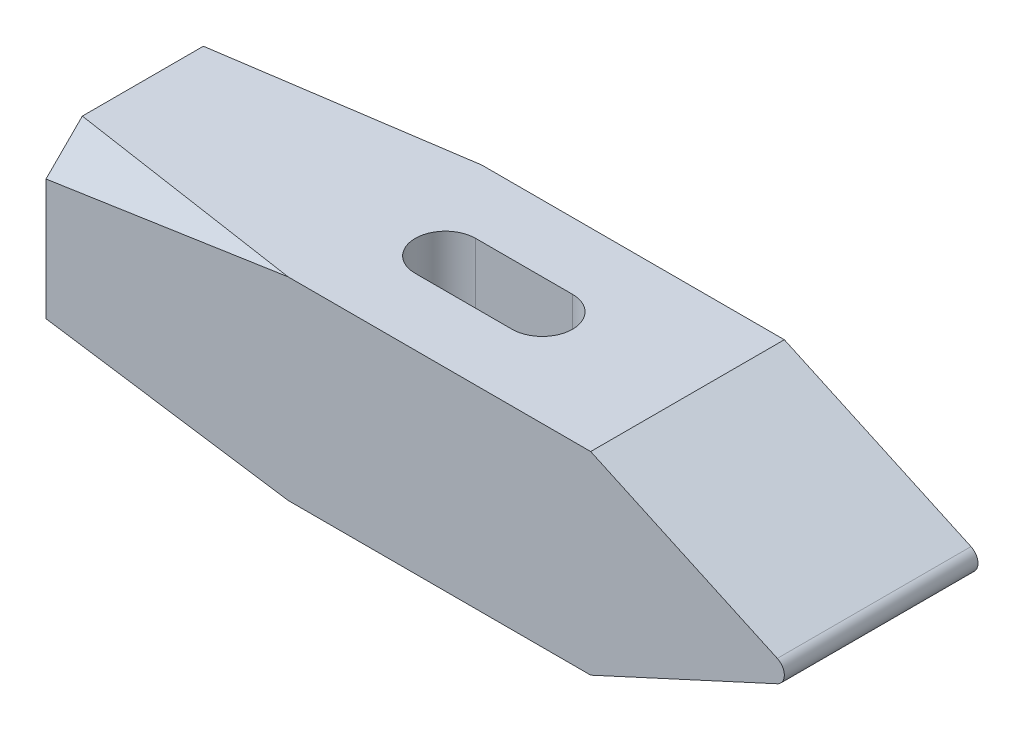
ISO-10303-21;
HEADER;
FILE_DESCRIPTION(('STEP AP214'),'2;1');
FILE_NAME('part.step','',(''),(''),'','','');
FILE_SCHEMA(('AUTOMOTIVE_DESIGN { 1 0 10303 214 1 1 1 1 }'));
ENDSEC;
DATA;
#1=APPLICATION_CONTEXT('core data for automotive mechanical design processes');
#2=APPLICATION_PROTOCOL_DEFINITION('international standard','automotive_design',2000,#1);
#3=PRODUCT_CONTEXT('',#1,'mechanical');
#4=PRODUCT('Part','Part','',(#3));
#5=PRODUCT_RELATED_PRODUCT_CATEGORY('part','',(#4));
#6=PRODUCT_DEFINITION_FORMATION('','',#4);
#7=PRODUCT_DEFINITION_CONTEXT('part definition',#1,'design');
#8=PRODUCT_DEFINITION('design','',#6,#7);
#9=PRODUCT_DEFINITION_SHAPE('','',#8);
#10=(LENGTH_UNIT() NAMED_UNIT(*) SI_UNIT(.MILLI.,.METRE.));
#11=(NAMED_UNIT(*) PLANE_ANGLE_UNIT() SI_UNIT($,.RADIAN.));
#12=(NAMED_UNIT(*) SI_UNIT($,.STERADIAN.) SOLID_ANGLE_UNIT());
#13=UNCERTAINTY_MEASURE_WITH_UNIT(LENGTH_MEASURE(1.E-05),#10,'distance_accuracy_value','');
#14=(GEOMETRIC_REPRESENTATION_CONTEXT(3) GLOBAL_UNCERTAINTY_ASSIGNED_CONTEXT((#13)) GLOBAL_UNIT_ASSIGNED_CONTEXT((#10,
#11,#12)) REPRESENTATION_CONTEXT('',''));
#15=CARTESIAN_POINT('',(0.,0.,0.));
#16=DIRECTION('',(0.,0.,1.));
#17=DIRECTION('',(1.,0.,0.));
#18=AXIS2_PLACEMENT_3D('',#15,#16,#17);
#19=CARTESIAN_POINT('',(0.,16.,32.));
#20=DIRECTION('',(1.,0.,0.));
#21=DIRECTION('',(0.,1.,0.));
#22=AXIS2_PLACEMENT_3D('',#19,#20,#21);
#23=PLANE('',#22);
#24=DIRECTION('',(0.,0.,-1.));
#25=VECTOR('',#24,1.);
#26=CARTESIAN_POINT('',(0.,16.,32.));
#27=LINE('',#26,#25);
#28=CARTESIAN_POINT('',(0.,16.,26.));
#29=VERTEX_POINT('',#28);
#30=CARTESIAN_POINT('',(0.,16.,6.));
#31=VERTEX_POINT('',#30);
#32=EDGE_CURVE('E11',#29,#31,#27,.T.);
#33=ORIENTED_EDGE('',*,*,#32,.T.);
#34=DIRECTION('',(0.,-0.707106781186547,-0.707106781186547));
#35=VECTOR('',#34,1.);
#36=CARTESIAN_POINT('',(0.,10.,0.));
#37=LINE('',#36,#35);
#38=CARTESIAN_POINT('',(0.,10.,0.));
#39=VERTEX_POINT('',#38);
#40=EDGE_CURVE('E64',#31,#39,#37,.T.);
#41=ORIENTED_EDGE('',*,*,#40,.T.);
#42=DIRECTION('',(0.,-1.,0.));
#43=VECTOR('',#42,1.);
#44=CARTESIAN_POINT('',(0.,16.,0.));
#45=LINE('',#44,#43);
#46=CARTESIAN_POINT('',(0.,-10.,0.));
#47=VERTEX_POINT('',#46);
#48=EDGE_CURVE('E70',#39,#47,#45,.T.);
#49=ORIENTED_EDGE('',*,*,#48,.T.);
#50=DIRECTION('',(0.,0.707106781186547,-0.707106781186548));
#51=VECTOR('',#50,1.);
#52=CARTESIAN_POINT('',(0.,-10.,0.));
#53=LINE('',#52,#51);
#54=CARTESIAN_POINT('',(0.,-16.,6.));
#55=VERTEX_POINT('',#54);
#56=EDGE_CURVE('E213',#55,#47,#53,.T.);
#57=ORIENTED_EDGE('',*,*,#56,.F.);
#58=DIRECTION('',(0.,0.,-1.));
#59=VECTOR('',#58,1.);
#60=CARTESIAN_POINT('',(0.,-16.,32.));
#61=LINE('',#60,#59);
#62=CARTESIAN_POINT('',(0.,-16.,26.));
#63=VERTEX_POINT('',#62);
#64=EDGE_CURVE('E53',#63,#55,#61,.T.);
#65=ORIENTED_EDGE('',*,*,#64,.F.);
#66=DIRECTION('',(0.,-0.707106781186548,-0.707106781186547));
#67=VECTOR('',#66,1.);
#68=CARTESIAN_POINT('',(0.,-10.,32.));
#69=LINE('',#68,#67);
#70=CARTESIAN_POINT('',(0.,-10.,32.));
#71=VERTEX_POINT('',#70);
#72=EDGE_CURVE('E211',#71,#63,#69,.T.);
#73=ORIENTED_EDGE('',*,*,#72,.F.);
#74=DIRECTION('',(0.,-1.,0.));
#75=VECTOR('',#74,1.);
#76=CARTESIAN_POINT('',(0.,16.,32.));
#77=LINE('',#76,#75);
#78=CARTESIAN_POINT('',(0.,10.,32.));
#79=VERTEX_POINT('',#78);
#80=EDGE_CURVE('E283',#79,#71,#77,.T.);
#81=ORIENTED_EDGE('',*,*,#80,.F.);
#82=DIRECTION('',(0.,-0.707106781186548,0.707106781186547));
#83=VECTOR('',#82,1.);
#84=CARTESIAN_POINT('',(0.,21.,21.));
#85=LINE('',#84,#83);
#86=EDGE_CURVE('E228',#29,#79,#85,.T.);
#87=ORIENTED_EDGE('',*,*,#86,.F.);
#88=EDGE_LOOP('',(#33,#41,#49,#57,#65,#73,#81,#87));
#89=FACE_BOUND('',#88,.T.);
#90=ADVANCED_FACE('F44',(#89),#23,.F.);
#91=CARTESIAN_POINT('',(0.,-16.,32.));
#92=DIRECTION('',(0.,1.,0.));
#93=DIRECTION('',(0.,0.,1.));
#94=AXIS2_PLACEMENT_3D('',#91,#92,#93);
#95=PLANE('',#94);
#96=DIRECTION('',(-1.,0.,0.));
#97=VECTOR('',#96,1.);
#98=CARTESIAN_POINT('',(50.,-16.,11.));
#99=LINE('',#98,#97);
#100=CARTESIAN_POINT('',(66.,-16.,11.));
#101=VERTEX_POINT('',#100);
#102=CARTESIAN_POINT('',(50.,-16.,11.));
#103=VERTEX_POINT('',#102);
#104=EDGE_CURVE('E252',#101,#103,#99,.T.);
#105=ORIENTED_EDGE('',*,*,#104,.T.);
#106=CARTESIAN_POINT('',(50.,-16.,16.));
#107=DIRECTION('',(0.,1.,0.));
#108=DIRECTION('',(-1.,0.,0.));
#109=AXIS2_PLACEMENT_3D('',#106,#107,#108);
#110=CIRCLE('',#109,5.);
#111=CARTESIAN_POINT('',(50.,-16.,21.));
#112=VERTEX_POINT('',#111);
#113=EDGE_CURVE('E239',#103,#112,#110,.T.);
#114=ORIENTED_EDGE('',*,*,#113,.T.);
#115=DIRECTION('',(1.,0.,0.));
#116=VECTOR('',#115,1.);
#117=CARTESIAN_POINT('',(50.,-16.,21.));
#118=LINE('',#117,#116);
#119=CARTESIAN_POINT('',(66.,-16.,21.));
#120=VERTEX_POINT('',#119);
#121=EDGE_CURVE('E245',#112,#120,#118,.T.);
#122=ORIENTED_EDGE('',*,*,#121,.T.);
#123=CARTESIAN_POINT('',(66.,-16.,16.));
#124=DIRECTION('',(0.,1.,0.));
#125=DIRECTION('',(-1.,0.,0.));
#126=AXIS2_PLACEMENT_3D('',#123,#124,#125);
#127=CIRCLE('',#126,5.);
#128=EDGE_CURVE('E250',#120,#101,#127,.T.);
#129=ORIENTED_EDGE('',*,*,#128,.T.);
#130=EDGE_LOOP('',(#105,#114,#122,#129));
#131=FACE_BOUND('',#130,.T.);
#132=DIRECTION('',(-0.988936352868298,0.,0.148340452930245));
#133=VECTOR('',#132,1.);
#134=CARTESIAN_POINT('',(0.,-16.,6.));
#135=LINE('',#134,#133);
#136=CARTESIAN_POINT('',(40.,-16.,0.));
#137=VERTEX_POINT('',#136);
#138=EDGE_CURVE('E153',#137,#55,#135,.T.);
#139=ORIENTED_EDGE('',*,*,#138,.F.);
#140=DIRECTION('',(1.,0.,0.));
#141=VECTOR('',#140,1.);
#142=CARTESIAN_POINT('',(0.,-16.,0.));
#143=LINE('',#142,#141);
#144=CARTESIAN_POINT('',(90.,-16.,0.));
#145=VERTEX_POINT('',#144);
#146=EDGE_CURVE('E163',#137,#145,#143,.T.);
#147=ORIENTED_EDGE('',*,*,#146,.T.);
#148=DIRECTION('',(0.,0.,-1.));
#149=VECTOR('',#148,1.);
#150=CARTESIAN_POINT('',(90.,-16.,32.));
#151=LINE('',#150,#149);
#152=CARTESIAN_POINT('',(90.,-16.,32.));
#153=VERTEX_POINT('',#152);
#154=EDGE_CURVE('E197',#153,#145,#151,.T.);
#155=ORIENTED_EDGE('',*,*,#154,.F.);
#156=DIRECTION('',(1.,0.,0.));
#157=VECTOR('',#156,1.);
#158=CARTESIAN_POINT('',(0.,-16.,32.));
#159=LINE('',#158,#157);
#160=CARTESIAN_POINT('',(40.,-16.,32.));
#161=VERTEX_POINT('',#160);
#162=EDGE_CURVE('E286',#161,#153,#159,.T.);
#163=ORIENTED_EDGE('',*,*,#162,.F.);
#164=DIRECTION('',(0.988936352868298,0.,0.148340452930245));
#165=VECTOR('',#164,1.);
#166=CARTESIAN_POINT('',(0.,-16.,26.));
#167=LINE('',#166,#165);
#168=EDGE_CURVE('E208',#63,#161,#167,.T.);
#169=ORIENTED_EDGE('',*,*,#168,.F.);
#170=ORIENTED_EDGE('',*,*,#64,.T.);
#171=EDGE_LOOP('',(#139,#147,#155,#163,#169,#170));
#172=FACE_BOUND('',#171,.T.);
#173=ADVANCED_FACE('F206',(#131,#172),#95,.F.);
#174=CARTESIAN_POINT('',(120.,0.,0.));
#175=DIRECTION('',(0.,0.,1.));
#176=DIRECTION('',(1.,0.,0.));
#177=AXIS2_PLACEMENT_3D('',#174,#175,#176);
#178=PLANE('',#177);
#179=ORIENTED_EDGE('',*,*,#48,.F.);
#180=DIRECTION('',(0.988936352868298,0.148340452930245,0.));
#181=VECTOR('',#180,1.);
#182=CARTESIAN_POINT('',(40.,16.,0.));
#183=LINE('',#182,#181);
#184=CARTESIAN_POINT('',(40.,16.,0.));
#185=VERTEX_POINT('',#184);
#186=EDGE_CURVE('E148',#39,#185,#183,.T.);
#187=ORIENTED_EDGE('',*,*,#186,.T.);
#188=DIRECTION('',(-1.,0.,0.));
#189=VECTOR('',#188,1.);
#190=CARTESIAN_POINT('',(90.,16.,0.));
#191=LINE('',#190,#189);
#192=CARTESIAN_POINT('',(90.,16.,0.));
#193=VERTEX_POINT('',#192);
#194=EDGE_CURVE('E164',#193,#185,#191,.T.);
#195=ORIENTED_EDGE('',*,*,#194,.F.);
#196=DIRECTION('',(-0.908506717048987,0.417870249092793,0.));
#197=VECTOR('',#196,1.);
#198=CARTESIAN_POINT('',(120.835740498186,1.81701343409798,0.));
#199=LINE('',#198,#197);
#200=CARTESIAN_POINT('',(120.835740498186,1.81701343409798,0.));
#201=VERTEX_POINT('',#200);
#202=EDGE_CURVE('E177',#201,#193,#199,.T.);
#203=ORIENTED_EDGE('',*,*,#202,.F.);
#204=CARTESIAN_POINT('',(120.,0.,0.));
#205=DIRECTION('',(0.,0.,1.));
#206=DIRECTION('',(1.,0.,0.));
#207=AXIS2_PLACEMENT_3D('',#204,#205,#206);
#208=CIRCLE('',#207,2.00000000000001);
#209=CARTESIAN_POINT('',(120.835740498186,-1.81701343409798,0.));
#210=VERTEX_POINT('',#209);
#211=EDGE_CURVE('E176',#210,#201,#208,.T.);
#212=ORIENTED_EDGE('',*,*,#211,.F.);
#213=DIRECTION('',(0.908506717048987,0.417870249092793,0.));
#214=VECTOR('',#213,1.);
#215=CARTESIAN_POINT('',(90.,-16.,0.));
#216=LINE('',#215,#214);
#217=EDGE_CURVE('E166',#145,#210,#216,.T.);
#218=ORIENTED_EDGE('',*,*,#217,.F.);
#219=ORIENTED_EDGE('',*,*,#146,.F.);
#220=DIRECTION('',(0.988936352868298,-0.148340452930245,0.));
#221=VECTOR('',#220,1.);
#222=CARTESIAN_POINT('',(40.,-16.,0.));
#223=LINE('',#222,#221);
#224=EDGE_CURVE('E165',#47,#137,#223,.T.);
#225=ORIENTED_EDGE('',*,*,#224,.F.);
#226=EDGE_LOOP('',(#179,#187,#195,#203,#212,#218,#219,#225));
#227=FACE_BOUND('',#226,.T.);
#228=ADVANCED_FACE('F159',(#227),#178,.F.);
#229=CARTESIAN_POINT('',(90.,16.,32.));
#230=DIRECTION('',(0.,-1.,0.));
#231=DIRECTION('',(1.,0.,0.));
#232=AXIS2_PLACEMENT_3D('',#229,#230,#231);
#233=PLANE('',#232);
#234=DIRECTION('',(1.,0.,0.));
#235=VECTOR('',#234,1.);
#236=CARTESIAN_POINT('',(50.,16.,21.));
#237=LINE('',#236,#235);
#238=CARTESIAN_POINT('',(50.,16.,21.));
#239=VERTEX_POINT('',#238);
#240=CARTESIAN_POINT('',(66.,16.,21.));
#241=VERTEX_POINT('',#240);
#242=EDGE_CURVE('E259',#239,#241,#237,.T.);
#243=ORIENTED_EDGE('',*,*,#242,.F.);
#244=CARTESIAN_POINT('',(50.,16.,16.));
#245=DIRECTION('',(0.,1.,0.));
#246=DIRECTION('',(-1.,0.,0.));
#247=AXIS2_PLACEMENT_3D('',#244,#245,#246);
#248=CIRCLE('',#247,5.);
#249=CARTESIAN_POINT('',(50.,16.,11.));
#250=VERTEX_POINT('',#249);
#251=EDGE_CURVE('E236',#250,#239,#248,.T.);
#252=ORIENTED_EDGE('',*,*,#251,.F.);
#253=DIRECTION('',(-1.,0.,0.));
#254=VECTOR('',#253,1.);
#255=CARTESIAN_POINT('',(50.,16.,11.));
#256=LINE('',#255,#254);
#257=CARTESIAN_POINT('',(66.,16.,11.));
#258=VERTEX_POINT('',#257);
#259=EDGE_CURVE('E243',#258,#250,#256,.T.);
#260=ORIENTED_EDGE('',*,*,#259,.F.);
#261=CARTESIAN_POINT('',(66.,16.,16.));
#262=DIRECTION('',(0.,1.,0.));
#263=DIRECTION('',(-1.,0.,0.));
#264=AXIS2_PLACEMENT_3D('',#261,#262,#263);
#265=CIRCLE('',#264,5.);
#266=EDGE_CURVE('E263',#241,#258,#265,.T.);
#267=ORIENTED_EDGE('',*,*,#266,.F.);
#268=EDGE_LOOP('',(#243,#252,#260,#267));
#269=FACE_BOUND('',#268,.T.);
#270=ORIENTED_EDGE('',*,*,#194,.T.);
#271=DIRECTION('',(-0.988936352868298,0.,0.148340452930245));
#272=VECTOR('',#271,1.);
#273=CARTESIAN_POINT('',(0.,16.,6.));
#274=LINE('',#273,#272);
#275=EDGE_CURVE('E146',#185,#31,#274,.T.);
#276=ORIENTED_EDGE('',*,*,#275,.T.);
#277=ORIENTED_EDGE('',*,*,#32,.F.);
#278=DIRECTION('',(-0.988936352868298,0.,-0.148340452930245));
#279=VECTOR('',#278,1.);
#280=CARTESIAN_POINT('',(-3.81418092909536,16.,25.4278728606357));
#281=LINE('',#280,#279);
#282=CARTESIAN_POINT('',(40.,16.,32.));
#283=VERTEX_POINT('',#282);
#284=EDGE_CURVE('E232',#283,#29,#281,.T.);
#285=ORIENTED_EDGE('',*,*,#284,.F.);
#286=DIRECTION('',(-1.,0.,0.));
#287=VECTOR('',#286,1.);
#288=CARTESIAN_POINT('',(90.,16.,32.));
#289=LINE('',#288,#287);
#290=CARTESIAN_POINT('',(90.,16.,32.));
#291=VERTEX_POINT('',#290);
#292=EDGE_CURVE('E181',#291,#283,#289,.T.);
#293=ORIENTED_EDGE('',*,*,#292,.F.);
#294=DIRECTION('',(0.,0.,-1.));
#295=VECTOR('',#294,1.);
#296=CARTESIAN_POINT('',(90.,16.,32.));
#297=LINE('',#296,#295);
#298=EDGE_CURVE('E184',#291,#193,#297,.T.);
#299=ORIENTED_EDGE('',*,*,#298,.T.);
#300=EDGE_LOOP('',(#270,#276,#277,#285,#293,#299));
#301=FACE_BOUND('',#300,.T.);
#302=ADVANCED_FACE('F50',(#269,#301),#233,.F.);
#303=CARTESIAN_POINT('',(120.,0.,32.));
#304=DIRECTION('',(0.,0.,1.));
#305=DIRECTION('',(1.,0.,0.));
#306=AXIS2_PLACEMENT_3D('',#303,#304,#305);
#307=PLANE('',#306);
#308=DIRECTION('',(-0.988936352868298,0.148340452930245,0.));
#309=VECTOR('',#308,1.);
#310=CARTESIAN_POINT('',(40.,-16.,32.));
#311=LINE('',#310,#309);
#312=EDGE_CURVE('E221',#161,#71,#311,.T.);
#313=ORIENTED_EDGE('',*,*,#312,.F.);
#314=ORIENTED_EDGE('',*,*,#162,.T.);
#315=DIRECTION('',(0.908506717048987,0.417870249092793,0.));
#316=VECTOR('',#315,1.);
#317=CARTESIAN_POINT('',(90.,-16.,32.));
#318=LINE('',#317,#316);
#319=CARTESIAN_POINT('',(120.835740498186,-1.81701343409798,32.));
#320=VERTEX_POINT('',#319);
#321=EDGE_CURVE('E287',#153,#320,#318,.T.);
#322=ORIENTED_EDGE('',*,*,#321,.T.);
#323=CARTESIAN_POINT('',(120.,0.,32.));
#324=DIRECTION('',(0.,0.,1.));
#325=DIRECTION('',(1.,0.,0.));
#326=AXIS2_PLACEMENT_3D('',#323,#324,#325);
#327=CIRCLE('',#326,2.00000000000001);
#328=CARTESIAN_POINT('',(120.835740498186,1.81701343409798,32.));
#329=VERTEX_POINT('',#328);
#330=EDGE_CURVE('E291',#320,#329,#327,.T.);
#331=ORIENTED_EDGE('',*,*,#330,.T.);
#332=DIRECTION('',(-0.908506717048987,0.417870249092793,0.));
#333=VECTOR('',#332,1.);
#334=CARTESIAN_POINT('',(120.835740498186,1.81701343409798,32.));
#335=LINE('',#334,#333);
#336=EDGE_CURVE('E188',#329,#291,#335,.T.);
#337=ORIENTED_EDGE('',*,*,#336,.T.);
#338=ORIENTED_EDGE('',*,*,#292,.T.);
#339=DIRECTION('',(0.988936352868298,0.148340452930245,0.));
#340=VECTOR('',#339,1.);
#341=CARTESIAN_POINT('',(-1.46699266503668,9.77995110024451,32.));
#342=LINE('',#341,#340);
#343=EDGE_CURVE('E231',#79,#283,#342,.T.);
#344=ORIENTED_EDGE('',*,*,#343,.F.);
#345=ORIENTED_EDGE('',*,*,#80,.T.);
#346=EDGE_LOOP('',(#313,#314,#322,#331,#337,#338,#344,#345));
#347=FACE_BOUND('',#346,.T.);
#348=ADVANCED_FACE('F297',(#347),#307,.T.);
#349=CARTESIAN_POINT('',(90.,-16.,32.));
#350=DIRECTION('',(-0.417870249092793,0.908506717048987,0.));
#351=DIRECTION('',(-0.908506717048987,-0.417870249092793,0.));
#352=AXIS2_PLACEMENT_3D('',#349,#350,#351);
#353=PLANE('',#352);
#354=ORIENTED_EDGE('',*,*,#217,.T.);
#355=DIRECTION('',(0.,0.,-1.));
#356=VECTOR('',#355,1.);
#357=CARTESIAN_POINT('',(120.835740498186,-1.81701343409798,32.));
#358=LINE('',#357,#356);
#359=EDGE_CURVE('E195',#320,#210,#358,.T.);
#360=ORIENTED_EDGE('',*,*,#359,.F.);
#361=ORIENTED_EDGE('',*,*,#321,.F.);
#362=ORIENTED_EDGE('',*,*,#154,.T.);
#363=EDGE_LOOP('',(#354,#360,#361,#362));
#364=FACE_BOUND('',#363,.T.);
#365=ADVANCED_FACE('F318',(#364),#353,.F.);
#366=CARTESIAN_POINT('',(120.,0.,32.));
#367=DIRECTION('',(0.,0.,-1.));
#368=DIRECTION('',(-1.,0.,0.));
#369=AXIS2_PLACEMENT_3D('',#366,#367,#368);
#370=CYLINDRICAL_SURFACE('',#369,2.00000000000001);
#371=ORIENTED_EDGE('',*,*,#211,.T.);
#372=DIRECTION('',(0.,0.,-1.));
#373=VECTOR('',#372,1.);
#374=CARTESIAN_POINT('',(120.835740498186,1.81701343409798,32.));
#375=LINE('',#374,#373);
#376=EDGE_CURVE('E190',#329,#201,#375,.T.);
#377=ORIENTED_EDGE('',*,*,#376,.F.);
#378=ORIENTED_EDGE('',*,*,#330,.F.);
#379=ORIENTED_EDGE('',*,*,#359,.T.);
#380=EDGE_LOOP('',(#371,#377,#378,#379));
#381=FACE_BOUND('',#380,.T.);
#382=ADVANCED_FACE('F321',(#381),#370,.T.);
#383=CARTESIAN_POINT('',(120.835740498186,1.81701343409798,32.));
#384=DIRECTION('',(-0.417870249092793,-0.908506717048987,0.));
#385=DIRECTION('',(0.908506717048987,-0.417870249092793,0.));
#386=AXIS2_PLACEMENT_3D('',#383,#384,#385);
#387=PLANE('',#386);
#388=ORIENTED_EDGE('',*,*,#202,.T.);
#389=ORIENTED_EDGE('',*,*,#298,.F.);
#390=ORIENTED_EDGE('',*,*,#336,.F.);
#391=ORIENTED_EDGE('',*,*,#376,.T.);
#392=EDGE_LOOP('',(#388,#389,#390,#391));
#393=FACE_BOUND('',#392,.T.);
#394=ADVANCED_FACE('F308',(#393),#387,.F.);
#395=CARTESIAN_POINT('',(50.,-16.,16.));
#396=DIRECTION('',(0.,1.,0.));
#397=DIRECTION('',(-1.,0.,0.));
#398=AXIS2_PLACEMENT_3D('',#395,#396,#397);
#399=CYLINDRICAL_SURFACE('',#398,5.);
#400=ORIENTED_EDGE('',*,*,#251,.T.);
#401=DIRECTION('',(0.,1.,0.));
#402=VECTOR('',#401,1.);
#403=CARTESIAN_POINT('',(50.,-16.,21.));
#404=LINE('',#403,#402);
#405=EDGE_CURVE('E258',#112,#239,#404,.T.);
#406=ORIENTED_EDGE('',*,*,#405,.F.);
#407=ORIENTED_EDGE('',*,*,#113,.F.);
#408=DIRECTION('',(0.,1.,0.));
#409=VECTOR('',#408,1.);
#410=CARTESIAN_POINT('',(50.,-16.,11.));
#411=LINE('',#410,#409);
#412=EDGE_CURVE('E174',#103,#250,#411,.T.);
#413=ORIENTED_EDGE('',*,*,#412,.T.);
#414=EDGE_LOOP('',(#400,#406,#407,#413));
#415=FACE_BOUND('',#414,.T.);
#416=ADVANCED_FACE('F329',(#415),#399,.F.);
#417=CARTESIAN_POINT('',(50.,-16.,11.));
#418=DIRECTION('',(0.,0.,-1.));
#419=DIRECTION('',(-1.,0.,0.));
#420=AXIS2_PLACEMENT_3D('',#417,#418,#419);
#421=PLANE('',#420);
#422=ORIENTED_EDGE('',*,*,#259,.T.);
#423=ORIENTED_EDGE('',*,*,#412,.F.);
#424=ORIENTED_EDGE('',*,*,#104,.F.);
#425=DIRECTION('',(0.,1.,0.));
#426=VECTOR('',#425,1.);
#427=CARTESIAN_POINT('',(66.,-16.,11.));
#428=LINE('',#427,#426);
#429=EDGE_CURVE('E275',#101,#258,#428,.T.);
#430=ORIENTED_EDGE('',*,*,#429,.T.);
#431=EDGE_LOOP('',(#422,#423,#424,#430));
#432=FACE_BOUND('',#431,.T.);
#433=ADVANCED_FACE('F346',(#432),#421,.F.);
#434=CARTESIAN_POINT('',(66.,-16.,16.));
#435=DIRECTION('',(0.,1.,0.));
#436=DIRECTION('',(-1.,0.,0.));
#437=AXIS2_PLACEMENT_3D('',#434,#435,#436);
#438=CYLINDRICAL_SURFACE('',#437,5.);
#439=ORIENTED_EDGE('',*,*,#266,.T.);
#440=ORIENTED_EDGE('',*,*,#429,.F.);
#441=ORIENTED_EDGE('',*,*,#128,.F.);
#442=DIRECTION('',(0.,1.,0.));
#443=VECTOR('',#442,1.);
#444=CARTESIAN_POINT('',(66.,-16.,21.));
#445=LINE('',#444,#443);
#446=EDGE_CURVE('E274',#120,#241,#445,.T.);
#447=ORIENTED_EDGE('',*,*,#446,.T.);
#448=EDGE_LOOP('',(#439,#440,#441,#447));
#449=FACE_BOUND('',#448,.T.);
#450=ADVANCED_FACE('F358',(#449),#438,.F.);
#451=CARTESIAN_POINT('',(50.,-16.,21.));
#452=DIRECTION('',(0.,0.,1.));
#453=DIRECTION('',(1.,0.,0.));
#454=AXIS2_PLACEMENT_3D('',#451,#452,#453);
#455=PLANE('',#454);
#456=ORIENTED_EDGE('',*,*,#242,.T.);
#457=ORIENTED_EDGE('',*,*,#446,.F.);
#458=ORIENTED_EDGE('',*,*,#121,.F.);
#459=ORIENTED_EDGE('',*,*,#405,.T.);
#460=EDGE_LOOP('',(#456,#457,#458,#459));
#461=FACE_BOUND('',#460,.T.);
#462=ADVANCED_FACE('F359',(#461),#455,.F.);
#463=CARTESIAN_POINT('',(-3.114956736712,20.7663782447466,20.7663782447466));
#464=DIRECTION('',(-0.105474383090195,0.70316255393463,0.70316255393463));
#465=DIRECTION('',(0.,-0.707106781186547,0.707106781186547));
#466=AXIS2_PLACEMENT_3D('',#463,#464,#465);
#467=PLANE('',#466);
#468=ORIENTED_EDGE('',*,*,#86,.T.);
#469=ORIENTED_EDGE('',*,*,#343,.T.);
#470=ORIENTED_EDGE('',*,*,#284,.T.);
#471=EDGE_LOOP('',(#468,#469,#470));
#472=FACE_BOUND('',#471,.T.);
#473=ADVANCED_FACE('F313',(#472),#467,.T.);
#474=CARTESIAN_POINT('',(-3.11495673671199,-20.7663782447466,20.7663782447466));
#475=DIRECTION('',(0.105474383090194,0.70316255393463,-0.70316255393463));
#476=DIRECTION('',(0.,0.707106781186548,0.707106781186547));
#477=AXIS2_PLACEMENT_3D('',#474,#475,#476);
#478=PLANE('',#477);
#479=ORIENTED_EDGE('',*,*,#168,.T.);
#480=ORIENTED_EDGE('',*,*,#312,.T.);
#481=ORIENTED_EDGE('',*,*,#72,.T.);
#482=EDGE_LOOP('',(#479,#480,#481));
#483=FACE_BOUND('',#482,.T.);
#484=ADVANCED_FACE('F379',(#483),#478,.F.);
#485=CARTESIAN_POINT('',(-0.741656365883808,-4.94437577255872,-4.94437577255872));
#486=DIRECTION('',(-0.105474383090195,-0.70316255393463,-0.70316255393463));
#487=DIRECTION('',(0.,0.707106781186547,-0.707106781186548));
#488=AXIS2_PLACEMENT_3D('',#485,#486,#487);
#489=PLANE('',#488);
#490=ORIENTED_EDGE('',*,*,#138,.T.);
#491=ORIENTED_EDGE('',*,*,#56,.T.);
#492=ORIENTED_EDGE('',*,*,#224,.T.);
#493=EDGE_LOOP('',(#490,#491,#492));
#494=FACE_BOUND('',#493,.T.);
#495=ADVANCED_FACE('F385',(#494),#489,.T.);
#496=CARTESIAN_POINT('',(-0.741656365883807,4.94437577255872,-4.94437577255872));
#497=DIRECTION('',(0.105474383090194,-0.70316255393463,0.70316255393463));
#498=DIRECTION('',(0.,-0.707106781186548,-0.707106781186548));
#499=AXIS2_PLACEMENT_3D('',#496,#497,#498);
#500=PLANE('',#499);
#501=ORIENTED_EDGE('',*,*,#275,.F.);
#502=ORIENTED_EDGE('',*,*,#186,.F.);
#503=ORIENTED_EDGE('',*,*,#40,.F.);
#504=EDGE_LOOP('',(#501,#502,#503));
#505=FACE_BOUND('',#504,.T.);
#506=ADVANCED_FACE('F150',(#505),#500,.F.);
#507=CLOSED_SHELL('',(#90,#173,#228,#302,#348,#365,#382,#394,#416,#433,#450,#462,#473,#484,#495,#506));
#508=MANIFOLD_SOLID_BREP('B2',#507);
#509=ADVANCED_BREP_SHAPE_REPRESENTATION('',(#18,#508),#14);
#510=SHAPE_DEFINITION_REPRESENTATION(#9,#509);
ENDSEC;
END-ISO-10303-21;
